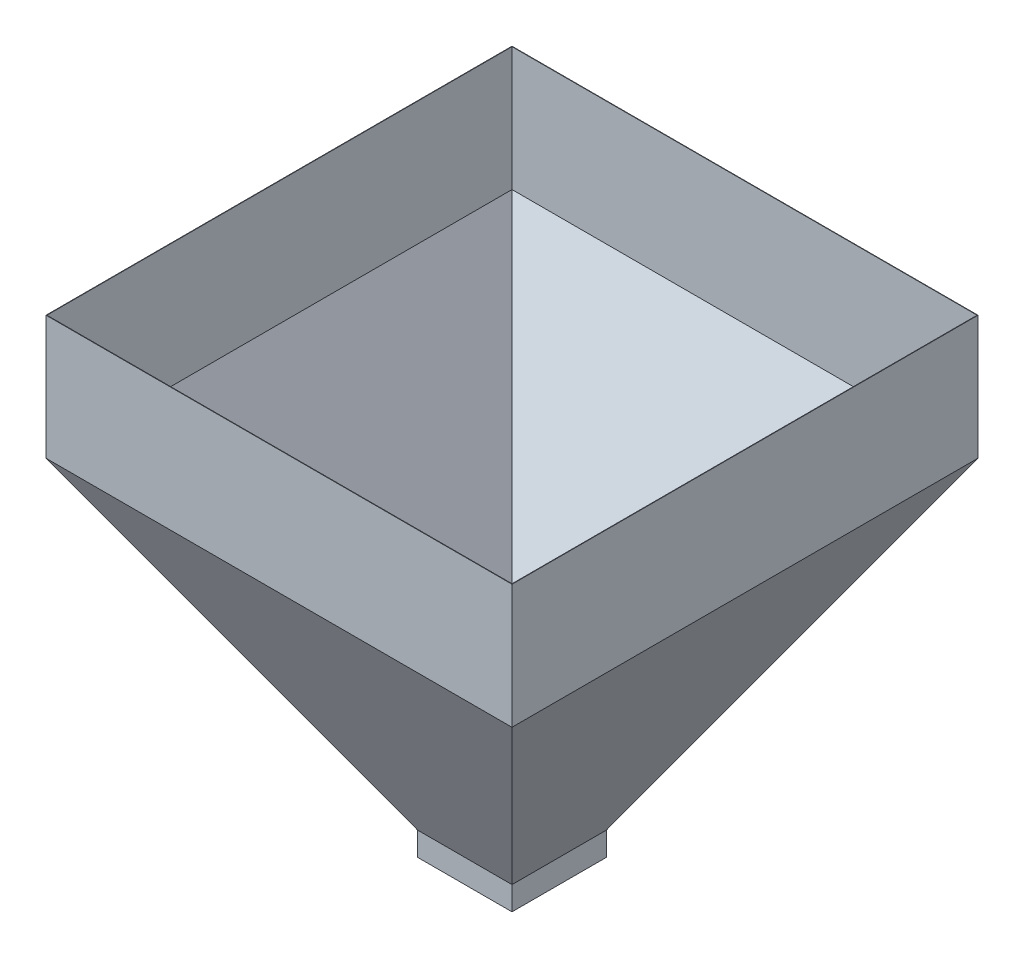
ISO-10303-21;
HEADER;
FILE_DESCRIPTION(('STEP AP214'),'2;1');
FILE_NAME('part.step','',(''),(''),'','','');
FILE_SCHEMA(('AUTOMOTIVE_DESIGN { 1 0 10303 214 1 1 1 1 }'));
ENDSEC;
DATA;
#1=APPLICATION_CONTEXT('core data for automotive mechanical design processes');
#2=APPLICATION_PROTOCOL_DEFINITION('international standard','automotive_design',2000,#1);
#3=PRODUCT_CONTEXT('',#1,'mechanical');
#4=PRODUCT('Part','Part','',(#3));
#5=PRODUCT_RELATED_PRODUCT_CATEGORY('part','',(#4));
#6=PRODUCT_DEFINITION_FORMATION('','',#4);
#7=PRODUCT_DEFINITION_CONTEXT('part definition',#1,'design');
#8=PRODUCT_DEFINITION('design','',#6,#7);
#9=PRODUCT_DEFINITION_SHAPE('','',#8);
#10=(LENGTH_UNIT() NAMED_UNIT(*) SI_UNIT(.MILLI.,.METRE.));
#11=(NAMED_UNIT(*) PLANE_ANGLE_UNIT() SI_UNIT($,.RADIAN.));
#12=(NAMED_UNIT(*) SI_UNIT($,.STERADIAN.) SOLID_ANGLE_UNIT());
#13=UNCERTAINTY_MEASURE_WITH_UNIT(LENGTH_MEASURE(1.E-05),#10,'distance_accuracy_value','');
#14=(GEOMETRIC_REPRESENTATION_CONTEXT(3) GLOBAL_UNCERTAINTY_ASSIGNED_CONTEXT((#13)) GLOBAL_UNIT_ASSIGNED_CONTEXT((#10,
#11,#12)) REPRESENTATION_CONTEXT('',''));
#15=CARTESIAN_POINT('',(0.,0.,0.));
#16=DIRECTION('',(0.,0.,1.));
#17=DIRECTION('',(1.,0.,0.));
#18=AXIS2_PLACEMENT_3D('',#15,#16,#17);
#19=CARTESIAN_POINT('',(-2.31345880299553E-13,-170.976692563818,-296.359600443951));
#20=DIRECTION('',(0.,-0.499722453489577,-0.866185586048601));
#21=DIRECTION('',(0.,0.866185586048601,-0.499722453489577));
#22=AXIS2_PLACEMENT_3D('',#19,#20,#21);
#23=PLANE('',#22);
#24=DIRECTION('',(-0.447014966311612,-0.774825941606795,0.447014966311612));
#25=VECTOR('',#24,1.);
#26=CARTESIAN_POINT('',(395.,0.,-395.));
#27=LINE('',#26,#25);
#28=CARTESIAN_POINT('',(395.,0.,-395.));
#29=VERTEX_POINT('',#28);
#30=CARTESIAN_POINT('',(80.0000000000001,-546.,-80.0000000000002));
#31=VERTEX_POINT('',#30);
#32=EDGE_CURVE('E276',#29,#31,#27,.T.);
#33=ORIENTED_EDGE('',*,*,#32,.T.);
#34=DIRECTION('',(-1.,0.,0.));
#35=VECTOR('',#34,1.);
#36=CARTESIAN_POINT('',(-80.0000000000001,-546.,-80.));
#37=LINE('',#36,#35);
#38=CARTESIAN_POINT('',(-80.0000000000001,-546.,-80.));
#39=VERTEX_POINT('',#38);
#40=EDGE_CURVE('E12',#31,#39,#37,.T.);
#41=ORIENTED_EDGE('',*,*,#40,.T.);
#42=DIRECTION('',(0.447014966311612,-0.774825941606795,0.447014966311612));
#43=VECTOR('',#42,1.);
#44=CARTESIAN_POINT('',(-395.,0.,-395.));
#45=LINE('',#44,#43);
#46=CARTESIAN_POINT('',(-395.,0.,-395.));
#47=VERTEX_POINT('',#46);
#48=EDGE_CURVE('E338',#47,#39,#45,.T.);
#49=ORIENTED_EDGE('',*,*,#48,.F.);
#50=DIRECTION('',(-1.,0.,0.));
#51=VECTOR('',#50,1.);
#52=CARTESIAN_POINT('',(-395.,0.,-395.));
#53=LINE('',#52,#51);
#54=EDGE_CURVE('E270',#29,#47,#53,.T.);
#55=ORIENTED_EDGE('',*,*,#54,.F.);
#56=EDGE_LOOP('',(#33,#41,#49,#55));
#57=FACE_BOUND('',#56,.T.);
#58=ADVANCED_FACE('F43',(#57),#23,.T.);
#59=CARTESIAN_POINT('',(-296.359600443951,-170.976692563818,2.57050978110614E-13));
#60=DIRECTION('',(-0.866185586048601,-0.499722453489577,0.));
#61=DIRECTION('',(0.499722453489577,-0.866185586048601,0.));
#62=AXIS2_PLACEMENT_3D('',#59,#60,#61);
#63=PLANE('',#62);
#64=ORIENTED_EDGE('',*,*,#48,.T.);
#65=DIRECTION('',(0.,0.,1.));
#66=VECTOR('',#65,1.);
#67=CARTESIAN_POINT('',(-80.0000000000001,-546.,-80.));
#68=LINE('',#67,#66);
#69=CARTESIAN_POINT('',(-80.,-546.,80.));
#70=VERTEX_POINT('',#69);
#71=EDGE_CURVE('E48',#39,#70,#68,.T.);
#72=ORIENTED_EDGE('',*,*,#71,.T.);
#73=DIRECTION('',(0.447014966311612,-0.774825941606795,-0.447014966311612));
#74=VECTOR('',#73,1.);
#75=CARTESIAN_POINT('',(-395.,0.,395.));
#76=LINE('',#75,#74);
#77=CARTESIAN_POINT('',(-395.,0.,395.));
#78=VERTEX_POINT('',#77);
#79=EDGE_CURVE('E337',#78,#70,#76,.T.);
#80=ORIENTED_EDGE('',*,*,#79,.F.);
#81=DIRECTION('',(0.,0.,1.));
#82=VECTOR('',#81,1.);
#83=CARTESIAN_POINT('',(-395.,0.,-395.));
#84=LINE('',#83,#82);
#85=EDGE_CURVE('E361',#47,#78,#84,.T.);
#86=ORIENTED_EDGE('',*,*,#85,.F.);
#87=EDGE_LOOP('',(#64,#72,#80,#86));
#88=FACE_BOUND('',#87,.T.);
#89=ADVANCED_FACE('F287',(#88),#63,.T.);
#90=CARTESIAN_POINT('',(296.359600443951,-170.976692563818,-1.02820391244246E-13));
#91=DIRECTION('',(0.866185586048601,-0.499722453489577,0.));
#92=DIRECTION('',(0.499722453489577,0.866185586048601,0.));
#93=AXIS2_PLACEMENT_3D('',#90,#91,#92);
#94=PLANE('',#93);
#95=DIRECTION('',(-0.447014966311612,-0.774825941606795,-0.447014966311612));
#96=VECTOR('',#95,1.);
#97=CARTESIAN_POINT('',(395.,0.,395.));
#98=LINE('',#97,#96);
#99=CARTESIAN_POINT('',(395.,0.,395.));
#100=VERTEX_POINT('',#99);
#101=CARTESIAN_POINT('',(80.0000000000001,-546.,80.));
#102=VERTEX_POINT('',#101);
#103=EDGE_CURVE('E330',#100,#102,#98,.T.);
#104=ORIENTED_EDGE('',*,*,#103,.T.);
#105=DIRECTION('',(0.,0.,-1.));
#106=VECTOR('',#105,1.);
#107=CARTESIAN_POINT('',(80.0000000000001,-546.,-80.0000000000002));
#108=LINE('',#107,#106);
#109=EDGE_CURVE('E308',#102,#31,#108,.T.);
#110=ORIENTED_EDGE('',*,*,#109,.T.);
#111=ORIENTED_EDGE('',*,*,#32,.F.);
#112=DIRECTION('',(0.,0.,-1.));
#113=VECTOR('',#112,1.);
#114=CARTESIAN_POINT('',(395.,0.,-395.));
#115=LINE('',#114,#113);
#116=EDGE_CURVE('E408',#100,#29,#115,.T.);
#117=ORIENTED_EDGE('',*,*,#116,.F.);
#118=EDGE_LOOP('',(#104,#110,#111,#117));
#119=FACE_BOUND('',#118,.T.);
#120=ADVANCED_FACE('F314',(#119),#94,.T.);
#121=CARTESIAN_POINT('',(0.,-170.976692563818,296.359600443951));
#122=DIRECTION('',(0.,-0.499722453489577,0.8661855860486));
#123=DIRECTION('',(0.,-0.8661855860486,-0.499722453489577));
#124=AXIS2_PLACEMENT_3D('',#121,#122,#123);
#125=PLANE('',#124);
#126=ORIENTED_EDGE('',*,*,#79,.T.);
#127=DIRECTION('',(1.,0.,0.));
#128=VECTOR('',#127,1.);
#129=CARTESIAN_POINT('',(-80.,-546.,80.));
#130=LINE('',#129,#128);
#131=EDGE_CURVE('E480',#70,#102,#130,.T.);
#132=ORIENTED_EDGE('',*,*,#131,.T.);
#133=ORIENTED_EDGE('',*,*,#103,.F.);
#134=DIRECTION('',(1.,0.,0.));
#135=VECTOR('',#134,1.);
#136=CARTESIAN_POINT('',(-395.,0.,395.));
#137=LINE('',#136,#135);
#138=EDGE_CURVE('E345',#78,#100,#137,.T.);
#139=ORIENTED_EDGE('',*,*,#138,.F.);
#140=EDGE_LOOP('',(#126,#132,#133,#139));
#141=FACE_BOUND('',#140,.T.);
#142=ADVANCED_FACE('F45',(#141),#125,.T.);
#143=CARTESIAN_POINT('',(-395.,210.,-395.));
#144=DIRECTION('',(1.,0.,0.));
#145=DIRECTION('',(0.,0.,-1.));
#146=AXIS2_PLACEMENT_3D('',#143,#144,#145);
#147=PLANE('',#146);
#148=ORIENTED_EDGE('',*,*,#85,.T.);
#149=DIRECTION('',(0.,-1.,0.));
#150=VECTOR('',#149,1.);
#151=CARTESIAN_POINT('',(-395.,210.,395.));
#152=LINE('',#151,#150);
#153=CARTESIAN_POINT('',(-395.,210.,395.));
#154=VERTEX_POINT('',#153);
#155=EDGE_CURVE('E412',#154,#78,#152,.T.);
#156=ORIENTED_EDGE('',*,*,#155,.F.);
#157=DIRECTION('',(0.,0.,1.));
#158=VECTOR('',#157,1.);
#159=CARTESIAN_POINT('',(-395.,210.,-395.));
#160=LINE('',#159,#158);
#161=CARTESIAN_POINT('',(-395.,210.,-395.));
#162=VERTEX_POINT('',#161);
#163=EDGE_CURVE('E243',#162,#154,#160,.T.);
#164=ORIENTED_EDGE('',*,*,#163,.F.);
#165=DIRECTION('',(0.,-1.,0.));
#166=VECTOR('',#165,1.);
#167=CARTESIAN_POINT('',(-395.,210.,-395.));
#168=LINE('',#167,#166);
#169=EDGE_CURVE('E263',#162,#47,#168,.T.);
#170=ORIENTED_EDGE('',*,*,#169,.T.);
#171=EDGE_LOOP('',(#148,#156,#164,#170));
#172=FACE_BOUND('',#171,.T.);
#173=ADVANCED_FACE('F288',(#172),#147,.F.);
#174=CARTESIAN_POINT('',(-395.,210.,395.));
#175=DIRECTION('',(0.,0.,-1.));
#176=DIRECTION('',(-1.,0.,0.));
#177=AXIS2_PLACEMENT_3D('',#174,#175,#176);
#178=PLANE('',#177);
#179=ORIENTED_EDGE('',*,*,#138,.T.);
#180=DIRECTION('',(0.,-1.,0.));
#181=VECTOR('',#180,1.);
#182=CARTESIAN_POINT('',(395.,210.,395.));
#183=LINE('',#182,#181);
#184=CARTESIAN_POINT('',(395.,210.,395.));
#185=VERTEX_POINT('',#184);
#186=EDGE_CURVE('E390',#185,#100,#183,.T.);
#187=ORIENTED_EDGE('',*,*,#186,.F.);
#188=DIRECTION('',(1.,0.,0.));
#189=VECTOR('',#188,1.);
#190=CARTESIAN_POINT('',(-395.,210.,395.));
#191=LINE('',#190,#189);
#192=EDGE_CURVE('E257',#154,#185,#191,.T.);
#193=ORIENTED_EDGE('',*,*,#192,.F.);
#194=ORIENTED_EDGE('',*,*,#155,.T.);
#195=EDGE_LOOP('',(#179,#187,#193,#194));
#196=FACE_BOUND('',#195,.T.);
#197=ADVANCED_FACE('F427',(#196),#178,.F.);
#198=CARTESIAN_POINT('',(395.,210.,-395.));
#199=DIRECTION('',(-1.,0.,0.));
#200=DIRECTION('',(0.,0.,1.));
#201=AXIS2_PLACEMENT_3D('',#198,#199,#200);
#202=PLANE('',#201);
#203=ORIENTED_EDGE('',*,*,#116,.T.);
#204=DIRECTION('',(0.,-1.,0.));
#205=VECTOR('',#204,1.);
#206=CARTESIAN_POINT('',(395.,210.,-395.));
#207=LINE('',#206,#205);
#208=CARTESIAN_POINT('',(395.,210.,-395.));
#209=VERTEX_POINT('',#208);
#210=EDGE_CURVE('E385',#209,#29,#207,.T.);
#211=ORIENTED_EDGE('',*,*,#210,.F.);
#212=DIRECTION('',(0.,0.,-1.));
#213=VECTOR('',#212,1.);
#214=CARTESIAN_POINT('',(395.,210.,-395.));
#215=LINE('',#214,#213);
#216=EDGE_CURVE('E259',#185,#209,#215,.T.);
#217=ORIENTED_EDGE('',*,*,#216,.F.);
#218=ORIENTED_EDGE('',*,*,#186,.T.);
#219=EDGE_LOOP('',(#203,#211,#217,#218));
#220=FACE_BOUND('',#219,.T.);
#221=ADVANCED_FACE('F428',(#220),#202,.F.);
#222=CARTESIAN_POINT('',(-395.,210.,-395.));
#223=DIRECTION('',(0.,0.,1.));
#224=DIRECTION('',(1.,0.,0.));
#225=AXIS2_PLACEMENT_3D('',#222,#223,#224);
#226=PLANE('',#225);
#227=ORIENTED_EDGE('',*,*,#54,.T.);
#228=ORIENTED_EDGE('',*,*,#169,.F.);
#229=DIRECTION('',(-1.,0.,0.));
#230=VECTOR('',#229,1.);
#231=CARTESIAN_POINT('',(-395.,210.,-395.));
#232=LINE('',#231,#230);
#233=EDGE_CURVE('E261',#209,#162,#232,.T.);
#234=ORIENTED_EDGE('',*,*,#233,.F.);
#235=ORIENTED_EDGE('',*,*,#210,.T.);
#236=EDGE_LOOP('',(#227,#228,#234,#235));
#237=FACE_BOUND('',#236,.T.);
#238=ADVANCED_FACE('F381',(#237),#226,.F.);
#239=CARTESIAN_POINT('',(0.,210.,0.));
#240=DIRECTION('',(0.,1.,0.));
#241=DIRECTION('',(0.,0.,1.));
#242=AXIS2_PLACEMENT_3D('',#239,#240,#241);
#243=PLANE('',#242);
#244=DIRECTION('',(0.,0.,1.));
#245=VECTOR('',#244,1.);
#246=CARTESIAN_POINT('',(-394.24,210.,-395.));
#247=LINE('',#246,#245);
#248=CARTESIAN_POINT('',(-394.24,210.,-394.24));
#249=VERTEX_POINT('',#248);
#250=CARTESIAN_POINT('',(-394.24,210.,394.24));
#251=VERTEX_POINT('',#250);
#252=EDGE_CURVE('E250',#249,#251,#247,.T.);
#253=ORIENTED_EDGE('',*,*,#252,.F.);
#254=DIRECTION('',(-1.,0.,0.));
#255=VECTOR('',#254,1.);
#256=CARTESIAN_POINT('',(-395.,210.,-394.24));
#257=LINE('',#256,#255);
#258=CARTESIAN_POINT('',(394.24,210.,-394.24));
#259=VERTEX_POINT('',#258);
#260=EDGE_CURVE('E238',#259,#249,#257,.T.);
#261=ORIENTED_EDGE('',*,*,#260,.F.);
#262=DIRECTION('',(0.,0.,-1.));
#263=VECTOR('',#262,1.);
#264=CARTESIAN_POINT('',(394.24,210.,-395.));
#265=LINE('',#264,#263);
#266=CARTESIAN_POINT('',(394.24,210.,394.24));
#267=VERTEX_POINT('',#266);
#268=EDGE_CURVE('E249',#267,#259,#265,.T.);
#269=ORIENTED_EDGE('',*,*,#268,.F.);
#270=DIRECTION('',(1.,0.,0.));
#271=VECTOR('',#270,1.);
#272=CARTESIAN_POINT('',(-395.,210.,394.24));
#273=LINE('',#272,#271);
#274=EDGE_CURVE('E247',#251,#267,#273,.T.);
#275=ORIENTED_EDGE('',*,*,#274,.F.);
#276=EDGE_LOOP('',(#253,#261,#269,#275));
#277=FACE_BOUND('',#276,.T.);
#278=ORIENTED_EDGE('',*,*,#163,.T.);
#279=ORIENTED_EDGE('',*,*,#192,.T.);
#280=ORIENTED_EDGE('',*,*,#216,.T.);
#281=ORIENTED_EDGE('',*,*,#233,.T.);
#282=EDGE_LOOP('',(#278,#279,#280,#281));
#283=FACE_BOUND('',#282,.T.);
#284=ADVANCED_FACE('F430',(#277,#283),#243,.T.);
#285=CARTESIAN_POINT('',(-2.30831993674583E-13,-170.596903499166,-295.701299398554));
#286=DIRECTION('',(0.,-0.499722453489577,-0.866185586048601));
#287=DIRECTION('',(0.,0.866185586048601,-0.499722453489577));
#288=AXIS2_PLACEMENT_3D('',#285,#286,#287);
#289=PLANE('',#288);
#290=DIRECTION('',(-0.447014966311612,-0.774825941606795,0.447014966311612));
#291=VECTOR('',#290,1.);
#292=CARTESIAN_POINT('',(236.613561952129,-273.015648406303,-236.613561952129));
#293=LINE('',#292,#291);
#294=CARTESIAN_POINT('',(394.24,0.203510876673651,-394.24));
#295=VERTEX_POINT('',#294);
#296=CARTESIAN_POINT('',(79.1225898788424,-546.,-79.1225898788424));
#297=VERTEX_POINT('',#296);
#298=EDGE_CURVE('E207',#295,#297,#293,.T.);
#299=ORIENTED_EDGE('',*,*,#298,.F.);
#300=DIRECTION('',(-1.,0.,0.));
#301=VECTOR('',#300,1.);
#302=CARTESIAN_POINT('',(0.,0.203510876673973,-394.24));
#303=LINE('',#302,#301);
#304=CARTESIAN_POINT('',(-394.24,0.203510876673918,-394.24));
#305=VERTEX_POINT('',#304);
#306=EDGE_CURVE('E211',#295,#305,#303,.T.);
#307=ORIENTED_EDGE('',*,*,#306,.T.);
#308=DIRECTION('',(0.447014966311613,-0.774825941606795,0.447014966311612));
#309=VECTOR('',#308,1.);
#310=CARTESIAN_POINT('',(-236.613561952129,-273.015648406303,-236.613561952129));
#311=LINE('',#310,#309);
#312=CARTESIAN_POINT('',(-79.1225898788424,-546.,-79.1225898788423));
#313=VERTEX_POINT('',#312);
#314=EDGE_CURVE('E210',#305,#313,#311,.T.);
#315=ORIENTED_EDGE('',*,*,#314,.T.);
#316=DIRECTION('',(-1.,0.,0.));
#317=VECTOR('',#316,1.);
#318=CARTESIAN_POINT('',(0.,-546.,-79.1225898788423));
#319=LINE('',#318,#317);
#320=EDGE_CURVE('E240',#297,#313,#319,.T.);
#321=ORIENTED_EDGE('',*,*,#320,.F.);
#322=EDGE_LOOP('',(#299,#307,#315,#321));
#323=FACE_BOUND('',#322,.T.);
#324=ADVANCED_FACE('F432',(#323),#289,.F.);
#325=CARTESIAN_POINT('',(-295.701299398554,-170.596903499166,2.56479992971759E-13));
#326=DIRECTION('',(-0.866185586048601,-0.499722453489577,0.));
#327=DIRECTION('',(0.499722453489577,-0.866185586048601,0.));
#328=AXIS2_PLACEMENT_3D('',#325,#326,#327);
#329=PLANE('',#328);
#330=ORIENTED_EDGE('',*,*,#314,.F.);
#331=DIRECTION('',(0.,0.,1.));
#332=VECTOR('',#331,1.);
#333=CARTESIAN_POINT('',(-394.24,0.203510876673862,0.));
#334=LINE('',#333,#332);
#335=CARTESIAN_POINT('',(-394.24,0.203510876673932,394.24));
#336=VERTEX_POINT('',#335);
#337=EDGE_CURVE('E216',#305,#336,#334,.T.);
#338=ORIENTED_EDGE('',*,*,#337,.T.);
#339=DIRECTION('',(0.447014966311612,-0.774825941606795,-0.447014966311613));
#340=VECTOR('',#339,1.);
#341=CARTESIAN_POINT('',(-236.613561952129,-273.015648406303,236.613561952129));
#342=LINE('',#341,#340);
#343=CARTESIAN_POINT('',(-79.1225898788423,-546.,79.1225898788422));
#344=VERTEX_POINT('',#343);
#345=EDGE_CURVE('E217',#336,#344,#342,.T.);
#346=ORIENTED_EDGE('',*,*,#345,.T.);
#347=DIRECTION('',(0.,0.,1.));
#348=VECTOR('',#347,1.);
#349=CARTESIAN_POINT('',(-79.1225898788423,-546.,0.));
#350=LINE('',#349,#348);
#351=EDGE_CURVE('E61',#313,#344,#350,.T.);
#352=ORIENTED_EDGE('',*,*,#351,.F.);
#353=EDGE_LOOP('',(#330,#338,#346,#352));
#354=FACE_BOUND('',#353,.T.);
#355=ADVANCED_FACE('F439',(#354),#329,.F.);
#356=CARTESIAN_POINT('',(295.701299398554,-170.596903499166,-1.02591997188704E-13));
#357=DIRECTION('',(0.866185586048601,-0.499722453489577,0.));
#358=DIRECTION('',(0.499722453489577,0.866185586048601,0.));
#359=AXIS2_PLACEMENT_3D('',#356,#357,#358);
#360=PLANE('',#359);
#361=DIRECTION('',(-0.447014966311612,-0.774825941606795,-0.447014966311613));
#362=VECTOR('',#361,1.);
#363=CARTESIAN_POINT('',(236.613561952129,-273.015648406303,236.613561952129));
#364=LINE('',#363,#362);
#365=CARTESIAN_POINT('',(394.24,0.203510876673478,394.24));
#366=VERTEX_POINT('',#365);
#367=CARTESIAN_POINT('',(79.1225898788424,-546.,79.1225898788422));
#368=VERTEX_POINT('',#367);
#369=EDGE_CURVE('E213',#366,#368,#364,.T.);
#370=ORIENTED_EDGE('',*,*,#369,.F.);
#371=DIRECTION('',(0.,0.,-1.));
#372=VECTOR('',#371,1.);
#373=CARTESIAN_POINT('',(394.24,0.203510876673668,0.));
#374=LINE('',#373,#372);
#375=EDGE_CURVE('E226',#366,#295,#374,.T.);
#376=ORIENTED_EDGE('',*,*,#375,.T.);
#377=ORIENTED_EDGE('',*,*,#298,.T.);
#378=DIRECTION('',(0.,0.,-1.));
#379=VECTOR('',#378,1.);
#380=CARTESIAN_POINT('',(79.1225898788424,-546.,0.));
#381=LINE('',#380,#379);
#382=EDGE_CURVE('E219',#368,#297,#381,.T.);
#383=ORIENTED_EDGE('',*,*,#382,.F.);
#384=EDGE_LOOP('',(#370,#376,#377,#383));
#385=FACE_BOUND('',#384,.T.);
#386=ADVANCED_FACE('F569',(#385),#360,.F.);
#387=CARTESIAN_POINT('',(0.,-170.596903499166,295.701299398554));
#388=DIRECTION('',(0.,-0.499722453489577,0.8661855860486));
#389=DIRECTION('',(0.,-0.8661855860486,-0.499722453489577));
#390=AXIS2_PLACEMENT_3D('',#387,#388,#389);
#391=PLANE('',#390);
#392=ORIENTED_EDGE('',*,*,#345,.F.);
#393=DIRECTION('',(1.,0.,0.));
#394=VECTOR('',#393,1.);
#395=CARTESIAN_POINT('',(0.,0.203510876673418,394.24));
#396=LINE('',#395,#394);
#397=EDGE_CURVE('E222',#336,#366,#396,.T.);
#398=ORIENTED_EDGE('',*,*,#397,.T.);
#399=ORIENTED_EDGE('',*,*,#369,.T.);
#400=DIRECTION('',(1.,0.,0.));
#401=VECTOR('',#400,1.);
#402=CARTESIAN_POINT('',(0.,-546.,79.1225898788422));
#403=LINE('',#402,#401);
#404=EDGE_CURVE('E180',#344,#368,#403,.T.);
#405=ORIENTED_EDGE('',*,*,#404,.F.);
#406=EDGE_LOOP('',(#392,#398,#399,#405));
#407=FACE_BOUND('',#406,.T.);
#408=ADVANCED_FACE('F585',(#407),#391,.F.);
#409=CARTESIAN_POINT('',(-394.24,210.,-395.));
#410=DIRECTION('',(1.,0.,0.));
#411=DIRECTION('',(0.,0.,-1.));
#412=AXIS2_PLACEMENT_3D('',#409,#410,#411);
#413=PLANE('',#412);
#414=ORIENTED_EDGE('',*,*,#337,.F.);
#415=DIRECTION('',(0.,-1.,0.));
#416=VECTOR('',#415,1.);
#417=CARTESIAN_POINT('',(-394.24,210.,-394.24));
#418=LINE('',#417,#416);
#419=EDGE_CURVE('E235',#249,#305,#418,.T.);
#420=ORIENTED_EDGE('',*,*,#419,.F.);
#421=ORIENTED_EDGE('',*,*,#252,.T.);
#422=DIRECTION('',(0.,-1.,0.));
#423=VECTOR('',#422,1.);
#424=CARTESIAN_POINT('',(-394.24,210.,394.24));
#425=LINE('',#424,#423);
#426=EDGE_CURVE('E229',#251,#336,#425,.T.);
#427=ORIENTED_EDGE('',*,*,#426,.T.);
#428=EDGE_LOOP('',(#414,#420,#421,#427));
#429=FACE_BOUND('',#428,.T.);
#430=ADVANCED_FACE('F579',(#429),#413,.T.);
#431=CARTESIAN_POINT('',(-395.,210.,394.24));
#432=DIRECTION('',(0.,0.,-1.));
#433=DIRECTION('',(-1.,0.,0.));
#434=AXIS2_PLACEMENT_3D('',#431,#432,#433);
#435=PLANE('',#434);
#436=ORIENTED_EDGE('',*,*,#397,.F.);
#437=ORIENTED_EDGE('',*,*,#426,.F.);
#438=ORIENTED_EDGE('',*,*,#274,.T.);
#439=DIRECTION('',(0.,-1.,0.));
#440=VECTOR('',#439,1.);
#441=CARTESIAN_POINT('',(394.24,210.,394.24));
#442=LINE('',#441,#440);
#443=EDGE_CURVE('E230',#267,#366,#442,.T.);
#444=ORIENTED_EDGE('',*,*,#443,.T.);
#445=EDGE_LOOP('',(#436,#437,#438,#444));
#446=FACE_BOUND('',#445,.T.);
#447=ADVANCED_FACE('F593',(#446),#435,.T.);
#448=CARTESIAN_POINT('',(394.24,210.,-395.));
#449=DIRECTION('',(-1.,0.,0.));
#450=DIRECTION('',(0.,0.,1.));
#451=AXIS2_PLACEMENT_3D('',#448,#449,#450);
#452=PLANE('',#451);
#453=ORIENTED_EDGE('',*,*,#375,.F.);
#454=ORIENTED_EDGE('',*,*,#443,.F.);
#455=ORIENTED_EDGE('',*,*,#268,.T.);
#456=DIRECTION('',(0.,-1.,0.));
#457=VECTOR('',#456,1.);
#458=CARTESIAN_POINT('',(394.24,210.,-394.24));
#459=LINE('',#458,#457);
#460=EDGE_CURVE('E69',#259,#295,#459,.T.);
#461=ORIENTED_EDGE('',*,*,#460,.T.);
#462=EDGE_LOOP('',(#453,#454,#455,#461));
#463=FACE_BOUND('',#462,.T.);
#464=ADVANCED_FACE('F573',(#463),#452,.T.);
#465=CARTESIAN_POINT('',(-395.,210.,-394.24));
#466=DIRECTION('',(0.,0.,1.));
#467=DIRECTION('',(1.,0.,0.));
#468=AXIS2_PLACEMENT_3D('',#465,#466,#467);
#469=PLANE('',#468);
#470=ORIENTED_EDGE('',*,*,#306,.F.);
#471=ORIENTED_EDGE('',*,*,#460,.F.);
#472=ORIENTED_EDGE('',*,*,#260,.T.);
#473=ORIENTED_EDGE('',*,*,#419,.T.);
#474=EDGE_LOOP('',(#470,#471,#472,#473));
#475=FACE_BOUND('',#474,.T.);
#476=ADVANCED_FACE('F445',(#475),#469,.T.);
#477=CARTESIAN_POINT('',(0.,-586.,0.));
#478=DIRECTION('',(0.,-1.,0.));
#479=DIRECTION('',(0.,0.,-1.));
#480=AXIS2_PLACEMENT_3D('',#477,#478,#479);
#481=PLANE('',#480);
#482=DIRECTION('',(0.,0.,-1.));
#483=VECTOR('',#482,1.);
#484=CARTESIAN_POINT('',(-80.,-586.,80.));
#485=LINE('',#484,#483);
#486=CARTESIAN_POINT('',(-80.,-586.,80.));
#487=VERTEX_POINT('',#486);
#488=CARTESIAN_POINT('',(-80.,-586.,-80.0000000000002));
#489=VERTEX_POINT('',#488);
#490=EDGE_CURVE('E181',#487,#489,#485,.T.);
#491=ORIENTED_EDGE('',*,*,#490,.T.);
#492=DIRECTION('',(1.,0.,0.));
#493=VECTOR('',#492,1.);
#494=CARTESIAN_POINT('',(-80.,-586.,-80.0000000000002));
#495=LINE('',#494,#493);
#496=CARTESIAN_POINT('',(80.0000000000001,-586.,-80.0000000000002));
#497=VERTEX_POINT('',#496);
#498=EDGE_CURVE('E200',#489,#497,#495,.T.);
#499=ORIENTED_EDGE('',*,*,#498,.T.);
#500=DIRECTION('',(0.,0.,1.));
#501=VECTOR('',#500,1.);
#502=CARTESIAN_POINT('',(80.0000000000001,-586.,80.));
#503=LINE('',#502,#501);
#504=CARTESIAN_POINT('',(80.0000000000001,-586.,80.));
#505=VERTEX_POINT('',#504);
#506=EDGE_CURVE('E202',#497,#505,#503,.T.);
#507=ORIENTED_EDGE('',*,*,#506,.T.);
#508=DIRECTION('',(-1.,0.,0.));
#509=VECTOR('',#508,1.);
#510=CARTESIAN_POINT('',(-80.,-586.,80.));
#511=LINE('',#510,#509);
#512=EDGE_CURVE('E204',#505,#487,#511,.T.);
#513=ORIENTED_EDGE('',*,*,#512,.T.);
#514=EDGE_LOOP('',(#491,#499,#507,#513));
#515=FACE_BOUND('',#514,.T.);
#516=DIRECTION('',(-1.,0.,0.));
#517=VECTOR('',#516,1.);
#518=CARTESIAN_POINT('',(79.1225898788424,-586.,79.1225898788422));
#519=LINE('',#518,#517);
#520=CARTESIAN_POINT('',(79.1225898788424,-586.,79.1225898788422));
#521=VERTEX_POINT('',#520);
#522=CARTESIAN_POINT('',(-79.1225898788423,-586.,79.1225898788422));
#523=VERTEX_POINT('',#522);
#524=EDGE_CURVE('E173',#521,#523,#519,.T.);
#525=ORIENTED_EDGE('',*,*,#524,.F.);
#526=DIRECTION('',(0.,0.,1.));
#527=VECTOR('',#526,1.);
#528=CARTESIAN_POINT('',(79.1225898788424,-586.,-79.1225898788424));
#529=LINE('',#528,#527);
#530=CARTESIAN_POINT('',(79.1225898788424,-586.,-79.1225898788424));
#531=VERTEX_POINT('',#530);
#532=EDGE_CURVE('E163',#531,#521,#529,.T.);
#533=ORIENTED_EDGE('',*,*,#532,.F.);
#534=DIRECTION('',(1.,0.,0.));
#535=VECTOR('',#534,1.);
#536=CARTESIAN_POINT('',(79.1225898788424,-586.,-79.1225898788424));
#537=LINE('',#536,#535);
#538=CARTESIAN_POINT('',(-79.1225898788423,-586.,-79.1225898788424));
#539=VERTEX_POINT('',#538);
#540=EDGE_CURVE('E189',#539,#531,#537,.T.);
#541=ORIENTED_EDGE('',*,*,#540,.F.);
#542=DIRECTION('',(0.,0.,-1.));
#543=VECTOR('',#542,1.);
#544=CARTESIAN_POINT('',(-79.1225898788423,-586.,-79.1225898788424));
#545=LINE('',#544,#543);
#546=EDGE_CURVE('E187',#523,#539,#545,.T.);
#547=ORIENTED_EDGE('',*,*,#546,.F.);
#548=EDGE_LOOP('',(#525,#533,#541,#547));
#549=FACE_BOUND('',#548,.T.);
#550=ADVANCED_FACE('F185',(#515,#549),#481,.T.);
#551=CARTESIAN_POINT('',(-80.,-586.,80.));
#552=DIRECTION('',(1.,0.,0.));
#553=DIRECTION('',(0.,0.,-1.));
#554=AXIS2_PLACEMENT_3D('',#551,#552,#553);
#555=PLANE('',#554);
#556=ORIENTED_EDGE('',*,*,#71,.F.);
#557=DIRECTION('',(0.,1.,0.));
#558=VECTOR('',#557,1.);
#559=CARTESIAN_POINT('',(-80.,-586.,-80.0000000000002));
#560=LINE('',#559,#558);
#561=EDGE_CURVE('E254',#489,#39,#560,.T.);
#562=ORIENTED_EDGE('',*,*,#561,.F.);
#563=ORIENTED_EDGE('',*,*,#490,.F.);
#564=DIRECTION('',(0.,1.,0.));
#565=VECTOR('',#564,1.);
#566=CARTESIAN_POINT('',(-80.,-586.,80.));
#567=LINE('',#566,#565);
#568=EDGE_CURVE('E206',#487,#70,#567,.T.);
#569=ORIENTED_EDGE('',*,*,#568,.T.);
#570=EDGE_LOOP('',(#556,#562,#563,#569));
#571=FACE_BOUND('',#570,.T.);
#572=ADVANCED_FACE('F521',(#571),#555,.F.);
#573=CARTESIAN_POINT('',(-80.,-586.,-80.0000000000002));
#574=DIRECTION('',(0.,0.,1.));
#575=DIRECTION('',(1.,0.,0.));
#576=AXIS2_PLACEMENT_3D('',#573,#574,#575);
#577=PLANE('',#576);
#578=ORIENTED_EDGE('',*,*,#40,.F.);
#579=DIRECTION('',(0.,1.,0.));
#580=VECTOR('',#579,1.);
#581=CARTESIAN_POINT('',(80.0000000000001,-586.,-80.0000000000002));
#582=LINE('',#581,#580);
#583=EDGE_CURVE('E498',#497,#31,#582,.T.);
#584=ORIENTED_EDGE('',*,*,#583,.F.);
#585=ORIENTED_EDGE('',*,*,#498,.F.);
#586=ORIENTED_EDGE('',*,*,#561,.T.);
#587=EDGE_LOOP('',(#578,#584,#585,#586));
#588=FACE_BOUND('',#587,.T.);
#589=ADVANCED_FACE('F510',(#588),#577,.F.);
#590=CARTESIAN_POINT('',(80.0000000000001,-586.,80.));
#591=DIRECTION('',(-1.,0.,0.));
#592=DIRECTION('',(0.,0.,1.));
#593=AXIS2_PLACEMENT_3D('',#590,#591,#592);
#594=PLANE('',#593);
#595=ORIENTED_EDGE('',*,*,#109,.F.);
#596=DIRECTION('',(0.,1.,0.));
#597=VECTOR('',#596,1.);
#598=CARTESIAN_POINT('',(80.0000000000001,-586.,80.));
#599=LINE('',#598,#597);
#600=EDGE_CURVE('E538',#505,#102,#599,.T.);
#601=ORIENTED_EDGE('',*,*,#600,.F.);
#602=ORIENTED_EDGE('',*,*,#506,.F.);
#603=ORIENTED_EDGE('',*,*,#583,.T.);
#604=EDGE_LOOP('',(#595,#601,#602,#603));
#605=FACE_BOUND('',#604,.T.);
#606=ADVANCED_FACE('F520',(#605),#594,.F.);
#607=CARTESIAN_POINT('',(-80.,-586.,80.));
#608=DIRECTION('',(0.,0.,-1.));
#609=DIRECTION('',(-1.,0.,0.));
#610=AXIS2_PLACEMENT_3D('',#607,#608,#609);
#611=PLANE('',#610);
#612=ORIENTED_EDGE('',*,*,#131,.F.);
#613=ORIENTED_EDGE('',*,*,#568,.F.);
#614=ORIENTED_EDGE('',*,*,#512,.F.);
#615=ORIENTED_EDGE('',*,*,#600,.T.);
#616=EDGE_LOOP('',(#612,#613,#614,#615));
#617=FACE_BOUND('',#616,.T.);
#618=ADVANCED_FACE('F542',(#617),#611,.F.);
#619=CARTESIAN_POINT('',(79.1225898788424,-586.,-79.1225898788424));
#620=DIRECTION('',(-1.,0.,0.));
#621=DIRECTION('',(0.,0.,1.));
#622=AXIS2_PLACEMENT_3D('',#619,#620,#621);
#623=PLANE('',#622);
#624=ORIENTED_EDGE('',*,*,#382,.T.);
#625=DIRECTION('',(0.,1.,0.));
#626=VECTOR('',#625,1.);
#627=CARTESIAN_POINT('',(79.1225898788424,-586.,-79.1225898788424));
#628=LINE('',#627,#626);
#629=EDGE_CURVE('E169',#531,#297,#628,.T.);
#630=ORIENTED_EDGE('',*,*,#629,.F.);
#631=ORIENTED_EDGE('',*,*,#532,.T.);
#632=DIRECTION('',(0.,1.,0.));
#633=VECTOR('',#632,1.);
#634=CARTESIAN_POINT('',(79.1225898788424,-586.,79.1225898788422));
#635=LINE('',#634,#633);
#636=EDGE_CURVE('E167',#521,#368,#635,.T.);
#637=ORIENTED_EDGE('',*,*,#636,.T.);
#638=EDGE_LOOP('',(#624,#630,#631,#637));
#639=FACE_BOUND('',#638,.T.);
#640=ADVANCED_FACE('F166',(#639),#623,.T.);
#641=CARTESIAN_POINT('',(79.1225898788424,-586.,79.1225898788422));
#642=DIRECTION('',(0.,0.,-1.));
#643=DIRECTION('',(-1.,0.,0.));
#644=AXIS2_PLACEMENT_3D('',#641,#642,#643);
#645=PLANE('',#644);
#646=ORIENTED_EDGE('',*,*,#404,.T.);
#647=ORIENTED_EDGE('',*,*,#636,.F.);
#648=ORIENTED_EDGE('',*,*,#524,.T.);
#649=DIRECTION('',(0.,1.,0.));
#650=VECTOR('',#649,1.);
#651=CARTESIAN_POINT('',(-79.1225898788423,-586.,79.1225898788422));
#652=LINE('',#651,#650);
#653=EDGE_CURVE('E182',#523,#344,#652,.T.);
#654=ORIENTED_EDGE('',*,*,#653,.T.);
#655=EDGE_LOOP('',(#646,#647,#648,#654));
#656=FACE_BOUND('',#655,.T.);
#657=ADVANCED_FACE('F177',(#656),#645,.T.);
#658=CARTESIAN_POINT('',(-79.1225898788423,-586.,-79.1225898788424));
#659=DIRECTION('',(1.,0.,0.));
#660=DIRECTION('',(0.,0.,-1.));
#661=AXIS2_PLACEMENT_3D('',#658,#659,#660);
#662=PLANE('',#661);
#663=ORIENTED_EDGE('',*,*,#351,.T.);
#664=ORIENTED_EDGE('',*,*,#653,.F.);
#665=ORIENTED_EDGE('',*,*,#546,.T.);
#666=DIRECTION('',(0.,1.,0.));
#667=VECTOR('',#666,1.);
#668=CARTESIAN_POINT('',(-79.1225898788423,-586.,-79.1225898788424));
#669=LINE('',#668,#667);
#670=EDGE_CURVE('E194',#539,#313,#669,.T.);
#671=ORIENTED_EDGE('',*,*,#670,.T.);
#672=EDGE_LOOP('',(#663,#664,#665,#671));
#673=FACE_BOUND('',#672,.T.);
#674=ADVANCED_FACE('F558',(#673),#662,.T.);
#675=CARTESIAN_POINT('',(79.1225898788424,-586.,-79.1225898788424));
#676=DIRECTION('',(0.,0.,1.));
#677=DIRECTION('',(1.,0.,0.));
#678=AXIS2_PLACEMENT_3D('',#675,#676,#677);
#679=PLANE('',#678);
#680=ORIENTED_EDGE('',*,*,#320,.T.);
#681=ORIENTED_EDGE('',*,*,#670,.F.);
#682=ORIENTED_EDGE('',*,*,#540,.T.);
#683=ORIENTED_EDGE('',*,*,#629,.T.);
#684=EDGE_LOOP('',(#680,#681,#682,#683));
#685=FACE_BOUND('',#684,.T.);
#686=ADVANCED_FACE('F561',(#685),#679,.T.);
#687=CLOSED_SHELL('',(#58,#89,#120,#142,#173,#197,#221,#238,#284,#324,#355,#386,#408,#430,#447,
#464,#476,#550,#572,#589,#606,#618,#640,#657,#674,#686));
#688=MANIFOLD_SOLID_BREP('B2',#687);
#689=ADVANCED_BREP_SHAPE_REPRESENTATION('',(#18,#688),#14);
#690=SHAPE_DEFINITION_REPRESENTATION(#9,#689);
ENDSEC;
END-ISO-10303-21;
